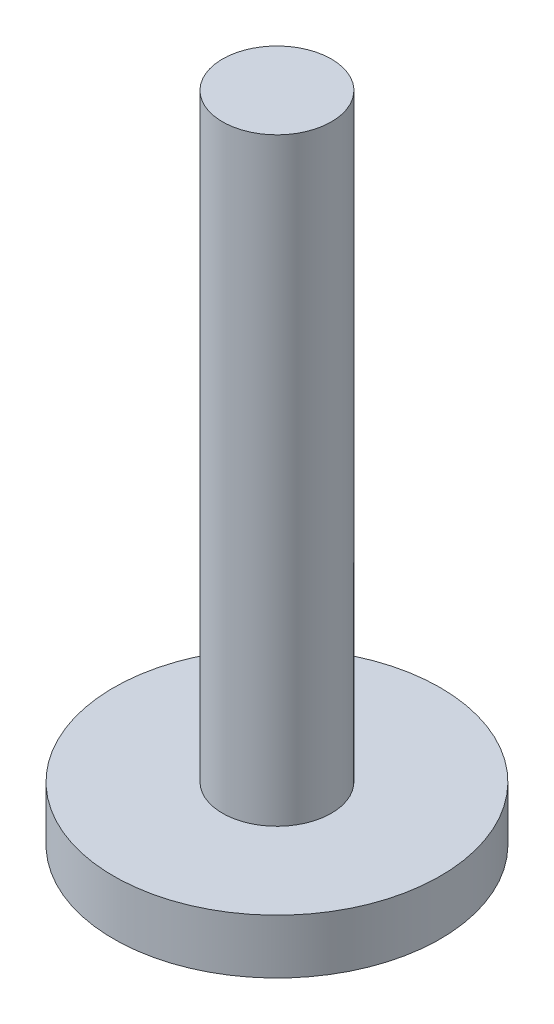
ISO-10303-21;
HEADER;
FILE_DESCRIPTION(('STEP AP214'),'2;1');
FILE_NAME('part.step','',(''),(''),'','','');
FILE_SCHEMA(('AUTOMOTIVE_DESIGN { 1 0 10303 214 1 1 1 1 }'));
ENDSEC;
DATA;
#1=APPLICATION_CONTEXT('core data for automotive mechanical design processes');
#2=APPLICATION_PROTOCOL_DEFINITION('international standard','automotive_design',2000,#1);
#3=PRODUCT_CONTEXT('',#1,'mechanical');
#4=PRODUCT('Part','Part','',(#3));
#5=PRODUCT_RELATED_PRODUCT_CATEGORY('part','',(#4));
#6=PRODUCT_DEFINITION_FORMATION('','',#4);
#7=PRODUCT_DEFINITION_CONTEXT('part definition',#1,'design');
#8=PRODUCT_DEFINITION('design','',#6,#7);
#9=PRODUCT_DEFINITION_SHAPE('','',#8);
#10=(LENGTH_UNIT() NAMED_UNIT(*) SI_UNIT(.MILLI.,.METRE.));
#11=(NAMED_UNIT(*) PLANE_ANGLE_UNIT() SI_UNIT($,.RADIAN.));
#12=(NAMED_UNIT(*) SI_UNIT($,.STERADIAN.) SOLID_ANGLE_UNIT());
#13=UNCERTAINTY_MEASURE_WITH_UNIT(LENGTH_MEASURE(1.E-05),#10,'distance_accuracy_value','');
#14=(GEOMETRIC_REPRESENTATION_CONTEXT(3) GLOBAL_UNCERTAINTY_ASSIGNED_CONTEXT((#13)) GLOBAL_UNIT_ASSIGNED_CONTEXT((#10,
#11,#12)) REPRESENTATION_CONTEXT('',''));
#15=CARTESIAN_POINT('',(0.,0.,0.));
#16=DIRECTION('',(0.,0.,1.));
#17=DIRECTION('',(1.,0.,0.));
#18=AXIS2_PLACEMENT_3D('',#15,#16,#17);
#19=CARTESIAN_POINT('',(19.05,0.,0.));
#20=DIRECTION('',(0.,-1.,0.));
#21=DIRECTION('',(0.,0.,-1.));
#22=AXIS2_PLACEMENT_3D('',#19,#20,#21);
#23=PLANE('',#22);
#24=CARTESIAN_POINT('',(0.,0.,0.));
#25=DIRECTION('',(0.,-1.,0.));
#26=DIRECTION('',(0.,0.,-1.));
#27=AXIS2_PLACEMENT_3D('',#24,#25,#26);
#28=CIRCLE('',#27,19.05);
#29=CARTESIAN_POINT('',(0.,0.,-19.05));
#30=VERTEX_POINT('',#29);
#31=EDGE_CURVE('E45',#30,#30,#28,.T.);
#32=ORIENTED_EDGE('',*,*,#31,.T.);
#33=EDGE_LOOP('',(#32));
#34=FACE_BOUND('',#33,.T.);
#35=ADVANCED_FACE('F31',(#34),#23,.T.);
#36=CARTESIAN_POINT('',(0.,76.2,0.));
#37=DIRECTION('',(0.,1.,0.));
#38=DIRECTION('',(0.,0.,1.));
#39=AXIS2_PLACEMENT_3D('',#36,#37,#38);
#40=PLANE('',#39);
#41=CARTESIAN_POINT('',(0.,76.2,0.));
#42=DIRECTION('',(0.,-1.,0.));
#43=DIRECTION('',(0.,0.,-1.));
#44=AXIS2_PLACEMENT_3D('',#41,#42,#43);
#45=CIRCLE('',#44,6.35);
#46=CARTESIAN_POINT('',(0.,76.2,-6.35));
#47=VERTEX_POINT('',#46);
#48=EDGE_CURVE('E10',#47,#47,#45,.T.);
#49=ORIENTED_EDGE('',*,*,#48,.F.);
#50=EDGE_LOOP('',(#49));
#51=FACE_BOUND('',#50,.T.);
#52=ADVANCED_FACE('F63',(#51),#40,.T.);
#53=CARTESIAN_POINT('',(0.,0.,0.));
#54=DIRECTION('',(0.,-1.,0.));
#55=DIRECTION('',(0.,0.,-1.));
#56=AXIS2_PLACEMENT_3D('',#53,#54,#55);
#57=CYLINDRICAL_SURFACE('',#56,6.35);
#58=ORIENTED_EDGE('',*,*,#48,.T.);
#59=EDGE_LOOP('',(#58));
#60=FACE_BOUND('',#59,.T.);
#61=CARTESIAN_POINT('',(0.,6.35,0.));
#62=DIRECTION('',(0.,-1.,0.));
#63=DIRECTION('',(0.,0.,-1.));
#64=AXIS2_PLACEMENT_3D('',#61,#62,#63);
#65=CIRCLE('',#64,6.35000000000001);
#66=CARTESIAN_POINT('',(0.,6.35,-6.35000000000001));
#67=VERTEX_POINT('',#66);
#68=EDGE_CURVE('E37',#67,#67,#65,.T.);
#69=ORIENTED_EDGE('',*,*,#68,.F.);
#70=EDGE_LOOP('',(#69));
#71=FACE_BOUND('',#70,.T.);
#72=ADVANCED_FACE('F60',(#60,#71),#57,.T.);
#73=CARTESIAN_POINT('',(6.35000000000001,6.35,0.));
#74=DIRECTION('',(0.,1.,0.));
#75=DIRECTION('',(0.,0.,1.));
#76=AXIS2_PLACEMENT_3D('',#73,#74,#75);
#77=PLANE('',#76);
#78=ORIENTED_EDGE('',*,*,#68,.T.);
#79=EDGE_LOOP('',(#78));
#80=FACE_BOUND('',#79,.T.);
#81=CARTESIAN_POINT('',(0.,6.35,0.));
#82=DIRECTION('',(0.,-1.,0.));
#83=DIRECTION('',(0.,0.,-1.));
#84=AXIS2_PLACEMENT_3D('',#81,#82,#83);
#85=CIRCLE('',#84,19.05);
#86=CARTESIAN_POINT('',(0.,6.35,-19.05));
#87=VERTEX_POINT('',#86);
#88=EDGE_CURVE('E41',#87,#87,#85,.T.);
#89=ORIENTED_EDGE('',*,*,#88,.F.);
#90=EDGE_LOOP('',(#89));
#91=FACE_BOUND('',#90,.T.);
#92=ADVANCED_FACE('F54',(#80,#91),#77,.T.);
#93=CARTESIAN_POINT('',(0.,0.,0.));
#94=DIRECTION('',(0.,-1.,0.));
#95=DIRECTION('',(0.,0.,-1.));
#96=AXIS2_PLACEMENT_3D('',#93,#94,#95);
#97=CYLINDRICAL_SURFACE('',#96,19.05);
#98=ORIENTED_EDGE('',*,*,#88,.T.);
#99=EDGE_LOOP('',(#98));
#100=FACE_BOUND('',#99,.T.);
#101=ORIENTED_EDGE('',*,*,#31,.F.);
#102=EDGE_LOOP('',(#101));
#103=FACE_BOUND('',#102,.T.);
#104=ADVANCED_FACE('F52',(#100,#103),#97,.T.);
#105=CLOSED_SHELL('',(#35,#52,#72,#92,#104));
#106=MANIFOLD_SOLID_BREP('B2',#105);
#107=ADVANCED_BREP_SHAPE_REPRESENTATION('',(#18,#106),#14);
#108=SHAPE_DEFINITION_REPRESENTATION(#9,#107);
ENDSEC;
END-ISO-10303-21;
